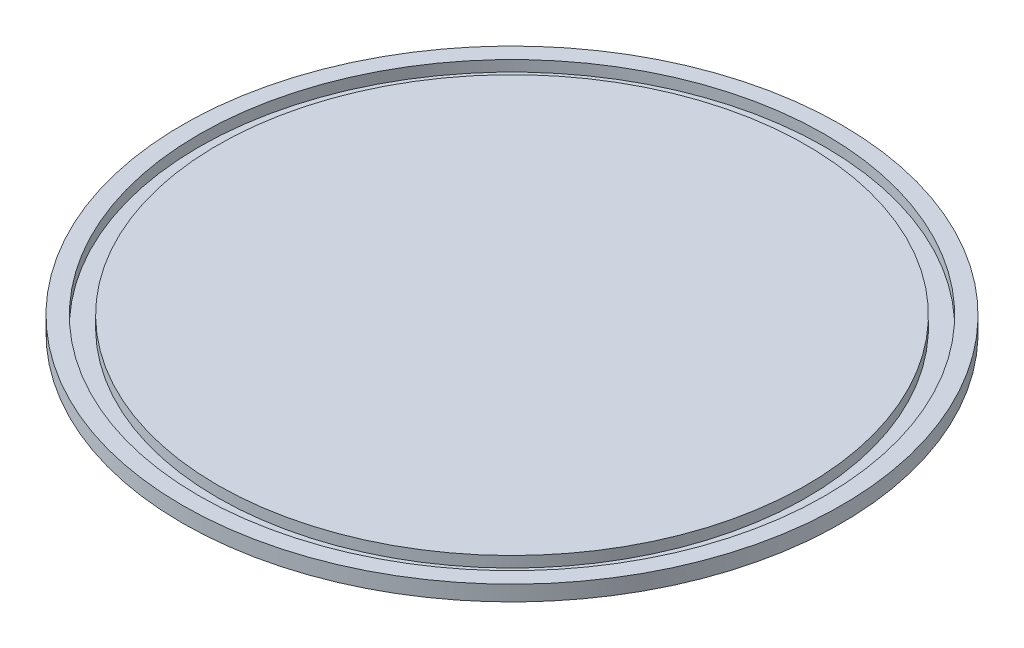
ISO-10303-21;
HEADER;
FILE_DESCRIPTION(('STEP AP214'),'2;1');
FILE_NAME('part.step','',(''),(''),'','','');
FILE_SCHEMA(('AUTOMOTIVE_DESIGN { 1 0 10303 214 1 1 1 1 }'));
ENDSEC;
DATA;
#1=APPLICATION_CONTEXT('core data for automotive mechanical design processes');
#2=APPLICATION_PROTOCOL_DEFINITION('international standard','automotive_design',2000,#1);
#3=PRODUCT_CONTEXT('',#1,'mechanical');
#4=PRODUCT('Part','Part','',(#3));
#5=PRODUCT_RELATED_PRODUCT_CATEGORY('part','',(#4));
#6=PRODUCT_DEFINITION_FORMATION('','',#4);
#7=PRODUCT_DEFINITION_CONTEXT('part definition',#1,'design');
#8=PRODUCT_DEFINITION('design','',#6,#7);
#9=PRODUCT_DEFINITION_SHAPE('','',#8);
#10=(LENGTH_UNIT() NAMED_UNIT(*) SI_UNIT(.MILLI.,.METRE.));
#11=(NAMED_UNIT(*) PLANE_ANGLE_UNIT() SI_UNIT($,.RADIAN.));
#12=(NAMED_UNIT(*) SI_UNIT($,.STERADIAN.) SOLID_ANGLE_UNIT());
#13=UNCERTAINTY_MEASURE_WITH_UNIT(LENGTH_MEASURE(1.E-05),#10,'distance_accuracy_value','');
#14=(GEOMETRIC_REPRESENTATION_CONTEXT(3) GLOBAL_UNCERTAINTY_ASSIGNED_CONTEXT((#13)) GLOBAL_UNIT_ASSIGNED_CONTEXT((#10,
#11,#12)) REPRESENTATION_CONTEXT('',''));
#15=CARTESIAN_POINT('',(0.,0.,0.));
#16=DIRECTION('',(0.,0.,1.));
#17=DIRECTION('',(1.,0.,0.));
#18=AXIS2_PLACEMENT_3D('',#15,#16,#17);
#19=CARTESIAN_POINT('',(0.,2.4,0.));
#20=DIRECTION('',(0.,-1.,0.));
#21=DIRECTION('',(0.,0.,-1.));
#22=AXIS2_PLACEMENT_3D('',#19,#20,#21);
#23=CYLINDRICAL_SURFACE('',#22,69.1);
#24=CARTESIAN_POINT('',(0.,2.4,0.));
#25=DIRECTION('',(0.,1.,0.));
#26=DIRECTION('',(0.,0.,1.));
#27=AXIS2_PLACEMENT_3D('',#24,#25,#26);
#28=CIRCLE('',#27,69.1);
#29=CARTESIAN_POINT('',(0.,2.4,69.1));
#30=VERTEX_POINT('',#29);
#31=EDGE_CURVE('E40',#30,#30,#28,.T.);
#32=ORIENTED_EDGE('',*,*,#31,.T.);
#33=EDGE_LOOP('',(#32));
#34=FACE_BOUND('',#33,.T.);
#35=CARTESIAN_POINT('',(0.,0.,0.));
#36=DIRECTION('',(0.,1.,0.));
#37=DIRECTION('',(0.,0.,1.));
#38=AXIS2_PLACEMENT_3D('',#35,#36,#37);
#39=CIRCLE('',#38,69.1);
#40=CARTESIAN_POINT('',(0.,0.,69.1));
#41=VERTEX_POINT('',#40);
#42=EDGE_CURVE('E36',#41,#41,#39,.T.);
#43=ORIENTED_EDGE('',*,*,#42,.F.);
#44=EDGE_LOOP('',(#43));
#45=FACE_BOUND('',#44,.T.);
#46=ADVANCED_FACE('F33',(#34,#45),#23,.F.);
#47=CARTESIAN_POINT('',(0.,2.4,0.));
#48=DIRECTION('',(0.,-1.,0.));
#49=DIRECTION('',(0.,0.,-1.));
#50=AXIS2_PLACEMENT_3D('',#47,#48,#49);
#51=CYLINDRICAL_SURFACE('',#50,72.75);
#52=CARTESIAN_POINT('',(0.,2.4,0.));
#53=DIRECTION('',(0.,1.,0.));
#54=DIRECTION('',(0.,0.,1.));
#55=AXIS2_PLACEMENT_3D('',#52,#53,#54);
#56=CIRCLE('',#55,72.75);
#57=CARTESIAN_POINT('',(0.,2.4,72.75));
#58=VERTEX_POINT('',#57);
#59=EDGE_CURVE('E10',#58,#58,#56,.T.);
#60=ORIENTED_EDGE('',*,*,#59,.F.);
#61=EDGE_LOOP('',(#60));
#62=FACE_BOUND('',#61,.T.);
#63=CARTESIAN_POINT('',(0.,-1.,0.));
#64=DIRECTION('',(0.,1.,0.));
#65=DIRECTION('',(0.,0.,1.));
#66=AXIS2_PLACEMENT_3D('',#63,#64,#65);
#67=CIRCLE('',#66,72.75);
#68=CARTESIAN_POINT('',(0.,-1.,72.75));
#69=VERTEX_POINT('',#68);
#70=EDGE_CURVE('E46',#69,#69,#67,.T.);
#71=ORIENTED_EDGE('',*,*,#70,.T.);
#72=EDGE_LOOP('',(#71));
#73=FACE_BOUND('',#72,.T.);
#74=ADVANCED_FACE('F74',(#62,#73),#51,.T.);
#75=CARTESIAN_POINT('',(0.,2.4,0.));
#76=DIRECTION('',(0.,1.,0.));
#77=DIRECTION('',(0.,0.,1.));
#78=AXIS2_PLACEMENT_3D('',#75,#76,#77);
#79=PLANE('',#78);
#80=ORIENTED_EDGE('',*,*,#31,.F.);
#81=EDGE_LOOP('',(#80));
#82=FACE_BOUND('',#81,.T.);
#83=ORIENTED_EDGE('',*,*,#59,.T.);
#84=EDGE_LOOP('',(#83));
#85=FACE_BOUND('',#84,.T.);
#86=ADVANCED_FACE('F68',(#82,#85),#79,.T.);
#87=CARTESIAN_POINT('',(0.,0.,0.));
#88=DIRECTION('',(0.,1.,0.));
#89=DIRECTION('',(0.,0.,1.));
#90=AXIS2_PLACEMENT_3D('',#87,#88,#89);
#91=PLANE('',#90);
#92=CARTESIAN_POINT('',(0.,0.,0.));
#93=DIRECTION('',(0.,1.,0.));
#94=DIRECTION('',(0.,0.,1.));
#95=AXIS2_PLACEMENT_3D('',#92,#93,#94);
#96=CIRCLE('',#95,65.);
#97=CARTESIAN_POINT('',(0.,0.,65.));
#98=VERTEX_POINT('',#97);
#99=EDGE_CURVE('E50',#98,#98,#96,.T.);
#100=ORIENTED_EDGE('',*,*,#99,.F.);
#101=EDGE_LOOP('',(#100));
#102=FACE_BOUND('',#101,.T.);
#103=ORIENTED_EDGE('',*,*,#42,.T.);
#104=EDGE_LOOP('',(#103));
#105=FACE_BOUND('',#104,.T.);
#106=ADVANCED_FACE('F65',(#102,#105),#91,.T.);
#107=CARTESIAN_POINT('',(0.,-1.,0.));
#108=DIRECTION('',(0.,1.,0.));
#109=DIRECTION('',(0.,0.,1.));
#110=AXIS2_PLACEMENT_3D('',#107,#108,#109);
#111=PLANE('',#110);
#112=ORIENTED_EDGE('',*,*,#70,.F.);
#113=EDGE_LOOP('',(#112));
#114=FACE_BOUND('',#113,.T.);
#115=ADVANCED_FACE('F61',(#114),#111,.F.);
#116=CARTESIAN_POINT('',(0.,2.4,0.));
#117=DIRECTION('',(0.,-1.,0.));
#118=DIRECTION('',(0.,0.,-1.));
#119=AXIS2_PLACEMENT_3D('',#116,#117,#118);
#120=CYLINDRICAL_SURFACE('',#119,65.);
#121=CARTESIAN_POINT('',(0.,2.4,0.));
#122=DIRECTION('',(0.,1.,0.));
#123=DIRECTION('',(0.,0.,1.));
#124=AXIS2_PLACEMENT_3D('',#121,#122,#123);
#125=CIRCLE('',#124,65.);
#126=CARTESIAN_POINT('',(0.,2.4,65.));
#127=VERTEX_POINT('',#126);
#128=EDGE_CURVE('E49',#127,#127,#125,.T.);
#129=ORIENTED_EDGE('',*,*,#128,.F.);
#130=EDGE_LOOP('',(#129));
#131=FACE_BOUND('',#130,.T.);
#132=ORIENTED_EDGE('',*,*,#99,.T.);
#133=EDGE_LOOP('',(#132));
#134=FACE_BOUND('',#133,.T.);
#135=ADVANCED_FACE('F58',(#131,#134),#120,.T.);
#136=CARTESIAN_POINT('',(0.,2.4,0.));
#137=DIRECTION('',(0.,1.,0.));
#138=DIRECTION('',(0.,0.,1.));
#139=AXIS2_PLACEMENT_3D('',#136,#137,#138);
#140=PLANE('',#139);
#141=ORIENTED_EDGE('',*,*,#128,.T.);
#142=EDGE_LOOP('',(#141));
#143=FACE_BOUND('',#142,.T.);
#144=ADVANCED_FACE('F56',(#143),#140,.T.);
#145=CLOSED_SHELL('',(#46,#74,#86,#106,#115,#135,#144));
#146=MANIFOLD_SOLID_BREP('B2',#145);
#147=ADVANCED_BREP_SHAPE_REPRESENTATION('',(#18,#146),#14);
#148=SHAPE_DEFINITION_REPRESENTATION(#9,#147);
ENDSEC;
END-ISO-10303-21;
